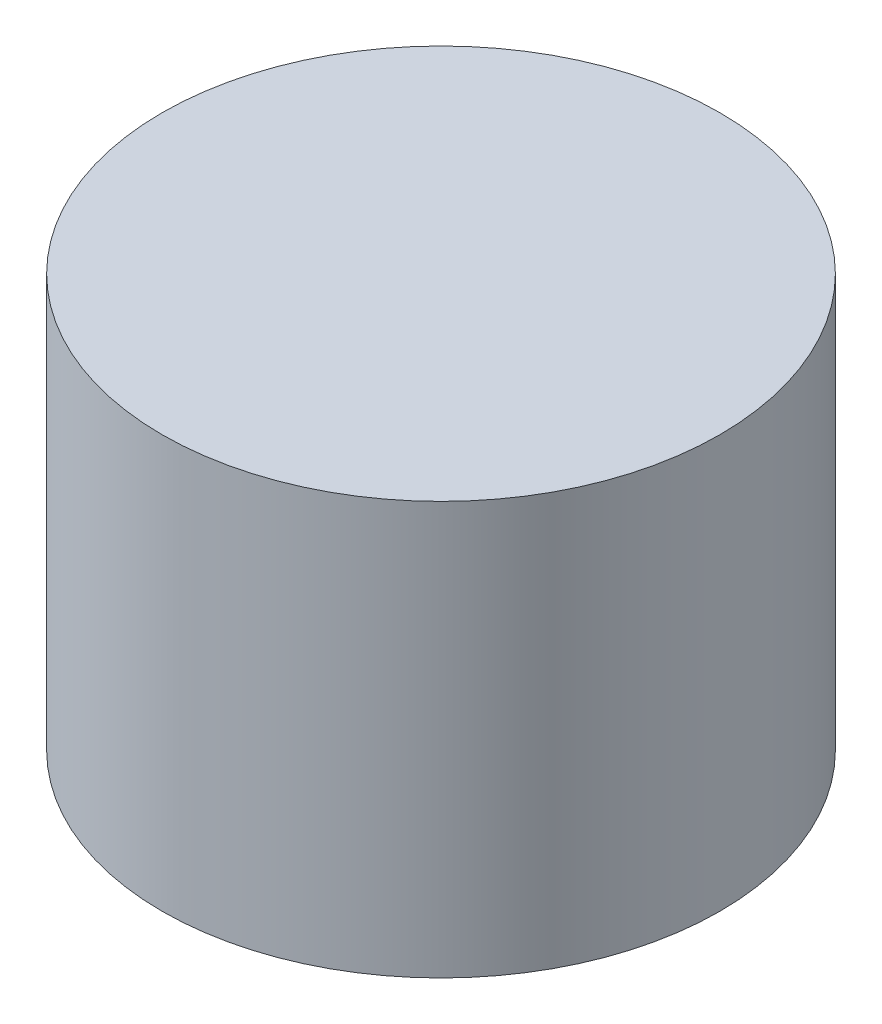
ISO-10303-21;
HEADER;
FILE_DESCRIPTION(('STEP AP214'),'2;1');
FILE_NAME('part.step','',(''),(''),'','','');
FILE_SCHEMA(('AUTOMOTIVE_DESIGN { 1 0 10303 214 1 1 1 1 }'));
ENDSEC;
DATA;
#1=APPLICATION_CONTEXT('core data for automotive mechanical design processes');
#2=APPLICATION_PROTOCOL_DEFINITION('international standard','automotive_design',2000,#1);
#3=PRODUCT_CONTEXT('',#1,'mechanical');
#4=PRODUCT('Part','Part','',(#3));
#5=PRODUCT_RELATED_PRODUCT_CATEGORY('part','',(#4));
#6=PRODUCT_DEFINITION_FORMATION('','',#4);
#7=PRODUCT_DEFINITION_CONTEXT('part definition',#1,'design');
#8=PRODUCT_DEFINITION('design','',#6,#7);
#9=PRODUCT_DEFINITION_SHAPE('','',#8);
#10=(LENGTH_UNIT() NAMED_UNIT(*) SI_UNIT(.MILLI.,.METRE.));
#11=(NAMED_UNIT(*) PLANE_ANGLE_UNIT() SI_UNIT($,.RADIAN.));
#12=(NAMED_UNIT(*) SI_UNIT($,.STERADIAN.) SOLID_ANGLE_UNIT());
#13=UNCERTAINTY_MEASURE_WITH_UNIT(LENGTH_MEASURE(1.E-05),#10,'distance_accuracy_value','');
#14=(GEOMETRIC_REPRESENTATION_CONTEXT(3) GLOBAL_UNCERTAINTY_ASSIGNED_CONTEXT((#13)) GLOBAL_UNIT_ASSIGNED_CONTEXT((#10,
#11,#12)) REPRESENTATION_CONTEXT('',''));
#15=CARTESIAN_POINT('',(0.,0.,0.));
#16=DIRECTION('',(0.,0.,1.));
#17=DIRECTION('',(1.,0.,0.));
#18=AXIS2_PLACEMENT_3D('',#15,#16,#17);
#19=CARTESIAN_POINT('',(-11.,-20.,0.));
#20=DIRECTION('',(0.,-1.,0.));
#21=DIRECTION('',(1.,0.,0.));
#22=AXIS2_PLACEMENT_3D('',#19,#20,#21);
#23=PLANE('',#22);
#24=DIRECTION('',(-0.5,0.,-0.866025403784439));
#25=VECTOR('',#24,1.);
#26=CARTESIAN_POINT('',(-10.1112159321677,-20.,-0.513139720814411));
#27=LINE('',#26,#25);
#28=CARTESIAN_POINT('',(-6.60890974693253,-20.,5.5530325356757));
#29=VERTEX_POINT('',#28);
#30=CARTESIAN_POINT('',(-8.11352211740294,-20.,2.9469674643243));
#31=VERTEX_POINT('',#30);
#32=EDGE_CURVE('E177',#29,#31,#27,.T.);
#33=ORIENTED_EDGE('',*,*,#32,.T.);
#34=CARTESIAN_POINT('',(0.,-20.,0.));
#35=DIRECTION('',(0.,-1.,0.));
#36=DIRECTION('',(1.,0.,0.));
#37=AXIS2_PLACEMENT_3D('',#34,#35,#36);
#38=CIRCLE('',#37,8.63214100819563);
#39=EDGE_CURVE('E211',#31,#29,#38,.F.);
#40=ORIENTED_EDGE('',*,*,#39,.T.);
#41=EDGE_LOOP('',(#33,#40));
#42=FACE_BOUND('',#41,.T.);
#43=ADVANCED_FACE('F35',(#42),#23,.F.);
#44=DIRECTION('',(-1.,0.,0.));
#45=VECTOR('',#44,1.);
#46=CARTESIAN_POINT('',(-11.,-20.,8.5));
#47=LINE('',#46,#45);
#48=CARTESIAN_POINT('',(1.5046123704704,-20.,8.5));
#49=VERTEX_POINT('',#48);
#50=CARTESIAN_POINT('',(-1.5046123704704,-20.,8.5));
#51=VERTEX_POINT('',#50);
#52=EDGE_CURVE('E174',#49,#51,#47,.T.);
#53=ORIENTED_EDGE('',*,*,#52,.T.);
#54=CARTESIAN_POINT('',(0.,-20.,0.));
#55=DIRECTION('',(0.,-1.,0.));
#56=DIRECTION('',(1.,0.,0.));
#57=AXIS2_PLACEMENT_3D('',#54,#55,#56);
#58=CIRCLE('',#57,8.63214100819563);
#59=EDGE_CURVE('E209',#51,#49,#58,.F.);
#60=ORIENTED_EDGE('',*,*,#59,.T.);
#61=EDGE_LOOP('',(#53,#60));
#62=FACE_BOUND('',#61,.T.);
#63=ADVANCED_FACE('F306',(#62),#23,.F.);
#64=DIRECTION('',(-0.5,0.,0.866025403784439));
#65=VECTOR('',#64,1.);
#66=CARTESIAN_POINT('',(4.61121593216773,-20.,9.01313972081442));
#67=LINE('',#66,#65);
#68=CARTESIAN_POINT('',(8.11352211740292,-20.,2.94696746432433));
#69=VERTEX_POINT('',#68);
#70=CARTESIAN_POINT('',(6.60890974693254,-20.,5.55303253567568));
#71=VERTEX_POINT('',#70);
#72=EDGE_CURVE('E167',#69,#71,#67,.T.);
#73=ORIENTED_EDGE('',*,*,#72,.T.);
#74=CARTESIAN_POINT('',(0.,-20.,0.));
#75=DIRECTION('',(0.,-1.,0.));
#76=DIRECTION('',(1.,0.,0.));
#77=AXIS2_PLACEMENT_3D('',#74,#75,#76);
#78=CIRCLE('',#77,8.63214100819563);
#79=EDGE_CURVE('E207',#71,#69,#78,.F.);
#80=ORIENTED_EDGE('',*,*,#79,.T.);
#81=EDGE_LOOP('',(#73,#80));
#82=FACE_BOUND('',#81,.T.);
#83=ADVANCED_FACE('F311',(#82),#23,.F.);
#84=DIRECTION('',(0.5,0.,0.866025403784439));
#85=VECTOR('',#84,1.);
#86=CARTESIAN_POINT('',(4.61121593216773,-20.,-9.0131397208144));
#87=LINE('',#86,#85);
#88=CARTESIAN_POINT('',(6.60890974693252,-20.,-5.55303253567571));
#89=VERTEX_POINT('',#88);
#90=CARTESIAN_POINT('',(8.11352211740294,-20.,-2.94696746432428));
#91=VERTEX_POINT('',#90);
#92=EDGE_CURVE('E186',#89,#91,#87,.T.);
#93=ORIENTED_EDGE('',*,*,#92,.T.);
#94=CARTESIAN_POINT('',(0.,-20.,0.));
#95=DIRECTION('',(0.,-1.,0.));
#96=DIRECTION('',(1.,0.,0.));
#97=AXIS2_PLACEMENT_3D('',#94,#95,#96);
#98=CIRCLE('',#97,8.63214100819563);
#99=EDGE_CURVE('E205',#91,#89,#98,.F.);
#100=ORIENTED_EDGE('',*,*,#99,.T.);
#101=EDGE_LOOP('',(#93,#100));
#102=FACE_BOUND('',#101,.T.);
#103=ADVANCED_FACE('F303',(#102),#23,.F.);
#104=DIRECTION('',(1.,0.,0.));
#105=VECTOR('',#104,1.);
#106=CARTESIAN_POINT('',(-11.,-20.,-8.5));
#107=LINE('',#106,#105);
#108=CARTESIAN_POINT('',(-1.50461237047042,-20.,-8.5));
#109=VERTEX_POINT('',#108);
#110=CARTESIAN_POINT('',(1.50461237047042,-20.,-8.5));
#111=VERTEX_POINT('',#110);
#112=EDGE_CURVE('E183',#109,#111,#107,.T.);
#113=ORIENTED_EDGE('',*,*,#112,.T.);
#114=CARTESIAN_POINT('',(0.,-20.,0.));
#115=DIRECTION('',(0.,-1.,0.));
#116=DIRECTION('',(1.,0.,0.));
#117=AXIS2_PLACEMENT_3D('',#114,#115,#116);
#118=CIRCLE('',#117,8.63214100819563);
#119=EDGE_CURVE('E203',#111,#109,#118,.F.);
#120=ORIENTED_EDGE('',*,*,#119,.T.);
#121=EDGE_LOOP('',(#113,#120));
#122=FACE_BOUND('',#121,.T.);
#123=ADVANCED_FACE('F294',(#122),#23,.F.);
#124=CARTESIAN_POINT('',(0.,0.,0.));
#125=DIRECTION('',(0.,-1.,0.));
#126=DIRECTION('',(-1.,0.,0.));
#127=AXIS2_PLACEMENT_3D('',#124,#125,#126);
#128=SPHERICAL_SURFACE('',#127,7.50000000000001);
#129=CARTESIAN_POINT('',(0.,1.25439547759709,0.));
#130=DIRECTION('',(0.,-1.,0.));
#131=DIRECTION('',(1.,0.,0.));
#132=AXIS2_PLACEMENT_3D('',#129,#130,#131);
#133=CIRCLE('',#132,7.39435541381289);
#134=CARTESIAN_POINT('',(7.39435541381289,1.25439547759709,0.));
#135=VERTEX_POINT('',#134);
#136=EDGE_CURVE('E195',#135,#135,#133,.T.);
#137=ORIENTED_EDGE('',*,*,#136,.T.);
#138=EDGE_LOOP('',(#137));
#139=FACE_BOUND('',#138,.T.);
#140=ADVANCED_FACE('F296',(#139),#128,.F.);
#141=CARTESIAN_POINT('',(0.,-20.,0.));
#142=DIRECTION('',(0.,-1.,0.));
#143=DIRECTION('',(1.,0.,0.));
#144=AXIS2_PLACEMENT_3D('',#141,#142,#143);
#145=CONICAL_SURFACE('',#144,11.,0.168042486170488);
#146=CARTESIAN_POINT('',(0.,-17.6654945393074,0.));
#147=DIRECTION('',(0.,-1.,0.));
#148=DIRECTION('',(1.,0.,0.));
#149=AXIS2_PLACEMENT_3D('',#146,#147,#148);
#150=CIRCLE('',#149,10.6039691185457);
#151=CARTESIAN_POINT('',(10.6039691185457,-17.6654945393074,0.));
#152=VERTEX_POINT('',#151);
#153=EDGE_CURVE('E198',#152,#152,#150,.T.);
#154=ORIENTED_EDGE('',*,*,#153,.T.);
#155=EDGE_LOOP('',(#154));
#156=FACE_BOUND('',#155,.T.);
#157=ORIENTED_EDGE('',*,*,#136,.F.);
#158=EDGE_LOOP('',(#157));
#159=FACE_BOUND('',#158,.T.);
#160=ADVANCED_FACE('F292',(#156,#159),#145,.F.);
#161=DIRECTION('',(0.5,0.,-0.866025403784439));
#162=VECTOR('',#161,1.);
#163=CARTESIAN_POINT('',(-10.1112159321677,-20.,0.513139720814411));
#164=LINE('',#163,#162);
#165=CARTESIAN_POINT('',(-8.11352211740294,-20.,-2.9469674643243));
#166=VERTEX_POINT('',#165);
#167=CARTESIAN_POINT('',(-6.60890974693253,-20.,-5.5530325356757));
#168=VERTEX_POINT('',#167);
#169=EDGE_CURVE('E180',#166,#168,#164,.T.);
#170=ORIENTED_EDGE('',*,*,#169,.T.);
#171=CARTESIAN_POINT('',(0.,-20.,0.));
#172=DIRECTION('',(0.,-1.,0.));
#173=DIRECTION('',(1.,0.,0.));
#174=AXIS2_PLACEMENT_3D('',#171,#172,#173);
#175=CIRCLE('',#174,8.63214100819563);
#176=EDGE_CURVE('E201',#168,#166,#175,.F.);
#177=ORIENTED_EDGE('',*,*,#176,.T.);
#178=EDGE_LOOP('',(#170,#177));
#179=FACE_BOUND('',#178,.T.);
#180=ADVANCED_FACE('F276',(#179),#23,.F.);
#181=CARTESIAN_POINT('',(4.90747728811182,-18.,-8.5));
#182=DIRECTION('',(0.866025403784439,0.,-0.5));
#183=DIRECTION('',(-0.5,0.,-0.866025403784439));
#184=AXIS2_PLACEMENT_3D('',#181,#182,#183);
#185=PLANE('',#184);
#186=DIRECTION('',(0.,-1.,0.));
#187=VECTOR('',#186,1.);
#188=CARTESIAN_POINT('',(4.90747728811182,-18.,-8.5));
#189=LINE('',#188,#187);
#190=CARTESIAN_POINT('',(4.90747728811182,-19.6127467449322,-8.5));
#191=VERTEX_POINT('',#190);
#192=CARTESIAN_POINT('',(4.90747728811182,-22.,-8.5));
#193=VERTEX_POINT('',#192);
#194=EDGE_CURVE('E165',#191,#193,#189,.T.);
#195=ORIENTED_EDGE('',*,*,#194,.T.);
#196=DIRECTION('',(0.5,0.,0.866025403784439));
#197=VECTOR('',#196,1.);
#198=CARTESIAN_POINT('',(4.90747728811182,-22.,-8.5));
#199=LINE('',#198,#197);
#200=CARTESIAN_POINT('',(9.81495457622364,-22.,0.));
#201=VERTEX_POINT('',#200);
#202=EDGE_CURVE('E150',#193,#201,#199,.T.);
#203=ORIENTED_EDGE('',*,*,#202,.T.);
#204=DIRECTION('',(0.,-1.,0.));
#205=VECTOR('',#204,1.);
#206=CARTESIAN_POINT('',(9.81495457622363,-18.,0.));
#207=LINE('',#206,#205);
#208=CARTESIAN_POINT('',(9.81495457622363,-19.6127467449322,0.));
#209=VERTEX_POINT('',#208);
#210=EDGE_CURVE('E141',#209,#201,#207,.T.);
#211=ORIENTED_EDGE('',*,*,#210,.F.);
#212=CARTESIAN_POINT('',(9.81495457622363,-19.6127467449322,0.));
#213=CARTESIAN_POINT('',(9.77143177180953,-19.6446416450822,-0.0753837085331061));
#214=CARTESIAN_POINT('',(9.72740201547438,-19.6736151409644,-0.151645483550461));
#215=CARTESIAN_POINT('',(9.63861698781365,-19.726385279256,-0.305425662410259));
#216=CARTESIAN_POINT('',(9.59386247618449,-19.7501870075362,-0.3829427504199));
#217=CARTESIAN_POINT('',(9.50400881521421,-19.7932538368433,-0.538573856466488));
#218=CARTESIAN_POINT('',(9.45891175082192,-19.8125366436572,-0.616684263266136));
#219=CARTESIAN_POINT('',(9.36834246528132,-19.8472799111159,-0.773554867427667));
#220=CARTESIAN_POINT('',(9.32287014496797,-19.862739325639,-0.852315236548439));
#221=CARTESIAN_POINT('',(9.18676291002431,-19.9039883883797,-1.08805988274857));
#222=CARTESIAN_POINT('',(9.09576295407781,-19.9249534215553,-1.24567642993445));
#223=CARTESIAN_POINT('',(8.9132907888821,-19.9575739447718,-1.56172749102052));
#224=CARTESIAN_POINT('',(8.82181818454491,-19.9692196516593,-1.72016268923318));
#225=CARTESIAN_POINT('',(8.67901550176883,-19.9824102913571,-1.96750419125849));
#226=CARTESIAN_POINT('',(8.62773070411942,-19.9861449599334,-2.05633206644315));
#227=CARTESIAN_POINT('',(8.52516074376336,-19.9920571588999,-2.23398844911018));
#228=CARTESIAN_POINT('',(8.47387559055704,-19.9942353532877,-2.32281694013747));
#229=CARTESIAN_POINT('',(8.37107893416187,-19.9974538334883,-2.5008659718621));
#230=CARTESIAN_POINT('',(8.31956739741149,-19.9984892323533,-2.59008657068972));
#231=CARTESIAN_POINT('',(8.21654419075095,-19.9997579764712,-2.76852799898444));
#232=CARTESIAN_POINT('',(8.16503252097513,-19.999991361655,-2.85774882821887));
#233=CARTESIAN_POINT('',(8.11352211740294,-20.,-2.94696746432428));
#234=B_SPLINE_CURVE_WITH_KNOTS('',3,(#212,#213,#214,#215,#216,#217,#218,#219,#220,#221,#222,
#223,#224,#225,#226,#227,#228,#229,#230,#231,#232,#233),.UNSPECIFIED.,.F.,.F.,(4,2,2,2,2,2,2,2,
2,2,4),(0.,0.277986713104551,0.555698806734272,0.83230387880707,1.1089845495155,
1.65820646982105,2.20800419349869,2.51590596143274,2.82367629881368,3.13275771876241,
3.4418237498686),.UNSPECIFIED.);
#235=EDGE_CURVE('E259',#209,#91,#234,.T.);
#236=ORIENTED_EDGE('',*,*,#235,.T.);
#237=ORIENTED_EDGE('',*,*,#92,.F.);
#238=CARTESIAN_POINT('',(6.60890974693252,-20.,-5.55303253567571));
#239=CARTESIAN_POINT('',(6.53720820085862,-19.9999675270954,-5.67722325645693));
#240=CARTESIAN_POINT('',(6.46550034313456,-19.9995305190983,-5.80142490933693));
#241=CARTESIAN_POINT('',(6.32208304385279,-19.9968304625014,-6.04983095837727));
#242=CARTESIAN_POINT('',(6.25037360381365,-19.9945671272494,-6.17403535190737));
#243=CARTESIAN_POINT('',(6.10749064395142,-19.9872227205461,-6.42151589792457));
#244=CARTESIAN_POINT('',(6.03631690011527,-19.9821615669874,-6.54479243841367));
#245=CARTESIAN_POINT('',(5.89405046679016,-19.9680160820096,-6.79120512914438));
#246=CARTESIAN_POINT('',(5.82295779485901,-19.9589310017301,-6.91434124897496));
#247=CARTESIAN_POINT('',(5.68052770484419,-19.93526709798,-7.16103740140725));
#248=CARTESIAN_POINT('',(5.60919167701496,-19.9206531281522,-7.28459502601762));
#249=CARTESIAN_POINT('',(5.46701474857931,-19.884302076187,-7.53085268973224));
#250=CARTESIAN_POINT('',(5.39617352888379,-19.8625701225869,-7.65355328151504));
#251=CARTESIAN_POINT('',(5.25481770503352,-19.8098736573513,-7.89838875036946));
#252=CARTESIAN_POINT('',(5.1843086346605,-19.7788471126284,-8.02051404264998));
#253=CARTESIAN_POINT('',(5.07959044370922,-19.7236467808191,-8.20189126985429));
#254=CARTESIAN_POINT('',(5.04481345111204,-19.7037713026189,-8.26212678796706));
#255=CARTESIAN_POINT('',(4.97574513988698,-19.6607774192049,-8.38175661220184));
#256=CARTESIAN_POINT('',(4.94145409629528,-19.6376572524118,-8.44115044194722));
#257=CARTESIAN_POINT('',(4.90747728811182,-19.612746744932,-8.5));
#258=B_SPLINE_CURVE_WITH_KNOTS('',3,(#238,#239,#240,#241,#242,#243,#244,#245,#246,#247,#248,
#249,#250,#251,#252,#253,#254,#255,#256,#257),.UNSPECIFIED.,.F.,.F.,(4,2,2,2,2,2,2,2,2,4),(0.,
0.430228697579471,0.860524935049129,1.28779658997689,1.71514779441003,2.14526254212575,
2.57506806956906,3.00780861502878,3.22475177823917,3.44181318136555),.UNSPECIFIED.);
#259=EDGE_CURVE('E265',#89,#191,#258,.T.);
#260=ORIENTED_EDGE('',*,*,#259,.T.);
#261=EDGE_LOOP('',(#195,#203,#211,#236,#237,#260));
#262=FACE_BOUND('',#261,.T.);
#263=ADVANCED_FACE('F271',(#262),#185,.F.);
#264=CARTESIAN_POINT('',(-4.90747728811182,-18.,-8.5));
#265=DIRECTION('',(0.,0.,-1.));
#266=DIRECTION('',(-1.,0.,0.));
#267=AXIS2_PLACEMENT_3D('',#264,#265,#266);
#268=PLANE('',#267);
#269=DIRECTION('',(0.,-1.,0.));
#270=VECTOR('',#269,1.);
#271=CARTESIAN_POINT('',(-4.90747728811182,-18.,-8.5));
#272=LINE('',#271,#270);
#273=CARTESIAN_POINT('',(-4.90747728811182,-19.6127467449322,-8.5));
#274=VERTEX_POINT('',#273);
#275=CARTESIAN_POINT('',(-4.90747728811182,-22.,-8.5));
#276=VERTEX_POINT('',#275);
#277=EDGE_CURVE('E63',#274,#276,#272,.T.);
#278=ORIENTED_EDGE('',*,*,#277,.T.);
#279=DIRECTION('',(1.,0.,0.));
#280=VECTOR('',#279,1.);
#281=CARTESIAN_POINT('',(-4.90747728811182,-22.,-8.5));
#282=LINE('',#281,#280);
#283=EDGE_CURVE('E162',#276,#193,#282,.T.);
#284=ORIENTED_EDGE('',*,*,#283,.T.);
#285=ORIENTED_EDGE('',*,*,#194,.F.);
#286=CARTESIAN_POINT('',(4.90747728811182,-19.6127467449322,-8.5));
#287=CARTESIAN_POINT('',(4.82043167928361,-19.6446416450822,-8.5));
#288=CARTESIAN_POINT('',(4.73237216661332,-19.6736151409644,-8.5));
#289=CARTESIAN_POINT('',(4.55480211129185,-19.726385279256,-8.5));
#290=CARTESIAN_POINT('',(4.46529308803353,-19.7501870075362,-8.5));
#291=CARTESIAN_POINT('',(4.28558576609298,-19.7932538368433,-8.5));
#292=CARTESIAN_POINT('',(4.1953916373084,-19.8125366436572,-8.5));
#293=CARTESIAN_POINT('',(4.0142530662272,-19.8472799111159,-8.5));
#294=CARTESIAN_POINT('',(3.9233084256005,-19.862739325639,-8.5));
#295=CARTESIAN_POINT('',(3.65109395571318,-19.9039883883797,-8.5));
#296=CARTESIAN_POINT('',(3.46909404382018,-19.9249534215553,-8.5));
#297=CARTESIAN_POINT('',(3.10414971342875,-19.9575739447718,-8.5));
#298=CARTESIAN_POINT('',(2.92120450475438,-19.9692196516593,-8.5));
#299=CARTESIAN_POINT('',(2.63559913920222,-19.982410291357,-8.5));
#300=CARTESIAN_POINT('',(2.5330295439034,-19.9861449599334,-8.5));
#301=CARTESIAN_POINT('',(2.32788962319127,-19.9920571588999,-8.5));
#302=CARTESIAN_POINT('',(2.22531931677864,-19.9942353532877,-8.5));
#303=CARTESIAN_POINT('',(2.01972600398829,-19.9974538334883,-8.5));
#304=CARTESIAN_POINT('',(1.91670293048752,-19.9984892323533,-8.5));
#305=CARTESIAN_POINT('',(1.71065651716645,-19.9997579764712,-8.5));
#306=CARTESIAN_POINT('',(1.60763317761479,-19.999991361655,-8.5));
#307=CARTESIAN_POINT('',(1.50461237047042,-20.,-8.5));
#308=B_SPLINE_CURVE_WITH_KNOTS('',3,(#286,#287,#288,#289,#290,#291,#292,#293,#294,#295,#296,
#297,#298,#299,#300,#301,#302,#303,#304,#305,#306,#307),.UNSPECIFIED.,.F.,.F.,(4,2,2,2,2,2,2,2,
2,2,4),(0.,0.277986713104548,0.555698806734269,0.832303878807064,1.10898454951549,
1.65820646982104,2.20800419349867,2.51590596143273,2.82367629881368,3.13275771876242,
3.44182374986861),.UNSPECIFIED.);
#309=EDGE_CURVE('E339',#191,#111,#308,.T.);
#310=ORIENTED_EDGE('',*,*,#309,.T.);
#311=ORIENTED_EDGE('',*,*,#112,.F.);
#312=CARTESIAN_POINT('',(-1.50461237047042,-20.,-8.5));
#313=CARTESIAN_POINT('',(-1.64801546261821,-19.9999675270954,-8.5));
#314=CARTESIAN_POINT('',(-1.79143117806633,-19.9995305190983,-8.5));
#315=CARTESIAN_POINT('',(-2.07826577662988,-19.9968304625014,-8.5));
#316=CARTESIAN_POINT('',(-2.22168465670815,-19.9945671272494,-8.5));
#317=CARTESIAN_POINT('',(-2.5074505764326,-19.9872227205461,-8.5));
#318=CARTESIAN_POINT('',(-2.6497980641049,-19.9821615669874,-8.5));
#319=CARTESIAN_POINT('',(-2.93433093075512,-19.9680160820096,-8.5));
#320=CARTESIAN_POINT('',(-3.07651627461743,-19.9589310017301,-8.5));
#321=CARTESIAN_POINT('',(-3.36137645464708,-19.93526709798,-8.5));
#322=CARTESIAN_POINT('',(-3.50404851030554,-19.9206531281522,-8.5));
#323=CARTESIAN_POINT('',(-3.78840236717683,-19.884302076187,-8.5));
#324=CARTESIAN_POINT('',(-3.93008480656788,-19.8625701225869,-8.5));
#325=CARTESIAN_POINT('',(-4.21279645426841,-19.8098736573513,-8.5));
#326=CARTESIAN_POINT('',(-4.35381459501445,-19.7788471126284,-8.5));
#327=CARTESIAN_POINT('',(-4.56325097691701,-19.7236467808191,-8.5));
#328=CARTESIAN_POINT('',(-4.63280496211138,-19.7037713026189,-8.5));
#329=CARTESIAN_POINT('',(-4.77094158456149,-19.6607774192049,-8.5));
#330=CARTESIAN_POINT('',(-4.8395236717449,-19.6376572524119,-8.5));
#331=CARTESIAN_POINT('',(-4.90747728811182,-19.612746744932,-8.5));
#332=B_SPLINE_CURVE_WITH_KNOTS('',3,(#312,#313,#314,#315,#316,#317,#318,#319,#320,#321,#322,
#323,#324,#325,#326,#327,#328,#329,#330,#331),.UNSPECIFIED.,.F.,.F.,(4,2,2,2,2,2,2,2,2,4),(0.,
0.43022869757947,0.860524935049128,1.28779658997689,1.71514779441003,2.14526254212575,
2.57506806956906,3.00780861502878,3.22475177823917,3.44181318136555),.UNSPECIFIED.);
#333=EDGE_CURVE('E340',#109,#274,#332,.T.);
#334=ORIENTED_EDGE('',*,*,#333,.T.);
#335=EDGE_LOOP('',(#278,#284,#285,#310,#311,#334));
#336=FACE_BOUND('',#335,.T.);
#337=ADVANCED_FACE('F275',(#336),#268,.F.);
#338=CARTESIAN_POINT('',(-9.81495457622364,-18.,0.));
#339=DIRECTION('',(-0.866025403784439,0.,-0.5));
#340=DIRECTION('',(-0.5,0.,0.866025403784439));
#341=AXIS2_PLACEMENT_3D('',#338,#339,#340);
#342=PLANE('',#341);
#343=DIRECTION('',(0.,-1.,0.));
#344=VECTOR('',#343,1.);
#345=CARTESIAN_POINT('',(-9.81495457622364,-18.,0.));
#346=LINE('',#345,#344);
#347=CARTESIAN_POINT('',(-9.81495457622364,-19.6127467449322,0.));
#348=VERTEX_POINT('',#347);
#349=CARTESIAN_POINT('',(-9.81495457622364,-22.,0.));
#350=VERTEX_POINT('',#349);
#351=EDGE_CURVE('E55',#348,#350,#346,.T.);
#352=ORIENTED_EDGE('',*,*,#351,.T.);
#353=DIRECTION('',(0.5,0.,-0.866025403784439));
#354=VECTOR('',#353,1.);
#355=CARTESIAN_POINT('',(-9.81495457622364,-22.,0.));
#356=LINE('',#355,#354);
#357=EDGE_CURVE('E157',#350,#276,#356,.T.);
#358=ORIENTED_EDGE('',*,*,#357,.T.);
#359=ORIENTED_EDGE('',*,*,#277,.F.);
#360=CARTESIAN_POINT('',(-4.90747728811182,-19.6127467449322,-8.5));
#361=CARTESIAN_POINT('',(-4.95100009252592,-19.6446416450822,-8.42461629146689));
#362=CARTESIAN_POINT('',(-4.99502984886107,-19.6736151409644,-8.34835451644954));
#363=CARTESIAN_POINT('',(-5.0838148765218,-19.726385279256,-8.19457433758974));
#364=CARTESIAN_POINT('',(-5.12856938815097,-19.7501870075362,-8.1170572495801));
#365=CARTESIAN_POINT('',(-5.21842304912124,-19.7932538368433,-7.96142614353351));
#366=CARTESIAN_POINT('',(-5.26352011351353,-19.8125366436572,-7.88331573673386));
#367=CARTESIAN_POINT('',(-5.35408939905413,-19.8472799111159,-7.72644513257233));
#368=CARTESIAN_POINT('',(-5.39956171936748,-19.862739325639,-7.64768476345156));
#369=CARTESIAN_POINT('',(-5.53566895431114,-19.9039883883797,-7.41194011725143));
#370=CARTESIAN_POINT('',(-5.62666891025764,-19.9249534215553,-7.25432357006556));
#371=CARTESIAN_POINT('',(-5.80914107545336,-19.9575739447718,-6.93827250897948));
#372=CARTESIAN_POINT('',(-5.90061367979054,-19.9692196516593,-6.77983731076683));
#373=CARTESIAN_POINT('',(-6.04341636256662,-19.982410291357,-6.53249580874152));
#374=CARTESIAN_POINT('',(-6.09470116021603,-19.9861449599334,-6.44366793355686));
#375=CARTESIAN_POINT('',(-6.1972711205721,-19.9920571588999,-6.26601155088982));
#376=CARTESIAN_POINT('',(-6.24855627377841,-19.9942353532877,-6.17718305986253));
#377=CARTESIAN_POINT('',(-6.35135293017358,-19.9974538334883,-5.99913402813789));
#378=CARTESIAN_POINT('',(-6.40286446692397,-19.9984892323533,-5.90991342931027));
#379=CARTESIAN_POINT('',(-6.50588767358451,-19.9997579764712,-5.73147200101555));
#380=CARTESIAN_POINT('',(-6.55739934336034,-19.999991361655,-5.64225117178111));
#381=CARTESIAN_POINT('',(-6.60890974693253,-20.,-5.5530325356757));
#382=B_SPLINE_CURVE_WITH_KNOTS('',3,(#360,#361,#362,#363,#364,#365,#366,#367,#368,#369,#370,
#371,#372,#373,#374,#375,#376,#377,#378,#379,#380,#381),.UNSPECIFIED.,.F.,.F.,(4,2,2,2,2,2,2,2,
2,2,4),(0.,0.277986713104549,0.55569880673427,0.832303878807066,1.10898454951549,
1.65820646982104,2.20800419349867,2.51590596143273,2.82367629881368,3.13275771876242,
3.44182374986862),.UNSPECIFIED.);
#383=EDGE_CURVE('E343',#274,#168,#382,.T.);
#384=ORIENTED_EDGE('',*,*,#383,.T.);
#385=ORIENTED_EDGE('',*,*,#169,.F.);
#386=CARTESIAN_POINT('',(-8.11352211740294,-20.,-2.9469674643243));
#387=CARTESIAN_POINT('',(-8.18522366347683,-19.9999675270954,-2.82277674354308));
#388=CARTESIAN_POINT('',(-8.25693152120089,-19.9995305190983,-2.69857509066308));
#389=CARTESIAN_POINT('',(-8.40034882048266,-19.9968304625014,-2.45016904162274));
#390=CARTESIAN_POINT('',(-8.4720582605218,-19.9945671272494,-2.32596464809264));
#391=CARTESIAN_POINT('',(-8.61494122038403,-19.9872227205461,-2.07848410207544));
#392=CARTESIAN_POINT('',(-8.68611496422018,-19.9821615669874,-1.95520756158634));
#393=CARTESIAN_POINT('',(-8.82838139754529,-19.9680160820096,-1.70879487085563));
#394=CARTESIAN_POINT('',(-8.89947406947644,-19.9589310017301,-1.58565875102505));
#395=CARTESIAN_POINT('',(-9.04190415949127,-19.93526709798,-1.33896259859276));
#396=CARTESIAN_POINT('',(-9.1132401873205,-19.9206531281522,-1.21540497398239));
#397=CARTESIAN_POINT('',(-9.25541711575614,-19.884302076187,-0.969147310267768));
#398=CARTESIAN_POINT('',(-9.32625833545167,-19.8625701225869,-0.846446718484971));
#399=CARTESIAN_POINT('',(-9.46761415930194,-19.8098736573513,-0.601611249630547));
#400=CARTESIAN_POINT('',(-9.53812322967496,-19.7788471126284,-0.479485957350027));
#401=CARTESIAN_POINT('',(-9.64284142062624,-19.7236467808191,-0.298108730145713));
#402=CARTESIAN_POINT('',(-9.67761841322342,-19.7037713026189,-0.237873212032946));
#403=CARTESIAN_POINT('',(-9.74668672444847,-19.6607774192049,-0.11824338779817));
#404=CARTESIAN_POINT('',(-9.78097776804018,-19.6376572524118,-0.0588495580527807));
#405=CARTESIAN_POINT('',(-9.81495457622364,-19.612746744932,0.));
#406=B_SPLINE_CURVE_WITH_KNOTS('',3,(#386,#387,#388,#389,#390,#391,#392,#393,#394,#395,#396,
#397,#398,#399,#400,#401,#402,#403,#404,#405),.UNSPECIFIED.,.F.,.F.,(4,2,2,2,2,2,2,2,2,4),(0.,
0.430228697579472,0.860524935049131,1.2877965899769,1.71514779441004,2.14526254212576,
2.57506806956907,3.0078086150288,3.22475177823918,3.44181318136556),.UNSPECIFIED.);
#407=EDGE_CURVE('E49',#166,#348,#406,.T.);
#408=ORIENTED_EDGE('',*,*,#407,.T.);
#409=EDGE_LOOP('',(#352,#358,#359,#384,#385,#408));
#410=FACE_BOUND('',#409,.T.);
#411=ADVANCED_FACE('F232',(#410),#342,.F.);
#412=CARTESIAN_POINT('',(-4.90747728811182,-18.,8.5));
#413=DIRECTION('',(-0.866025403784439,0.,0.5));
#414=DIRECTION('',(0.5,0.,0.866025403784439));
#415=AXIS2_PLACEMENT_3D('',#412,#413,#414);
#416=PLANE('',#415);
#417=DIRECTION('',(0.,-1.,0.));
#418=VECTOR('',#417,1.);
#419=CARTESIAN_POINT('',(-4.90747728811182,-18.,8.5));
#420=LINE('',#419,#418);
#421=CARTESIAN_POINT('',(-4.90747728811182,-19.6127467449322,8.5));
#422=VERTEX_POINT('',#421);
#423=CARTESIAN_POINT('',(-4.90747728811182,-22.,8.5));
#424=VERTEX_POINT('',#423);
#425=EDGE_CURVE('E140',#422,#424,#420,.T.);
#426=ORIENTED_EDGE('',*,*,#425,.T.);
#427=DIRECTION('',(-0.5,0.,-0.866025403784439));
#428=VECTOR('',#427,1.);
#429=CARTESIAN_POINT('',(-4.90747728811182,-22.,8.5));
#430=LINE('',#429,#428);
#431=EDGE_CURVE('E155',#424,#350,#430,.T.);
#432=ORIENTED_EDGE('',*,*,#431,.T.);
#433=ORIENTED_EDGE('',*,*,#351,.F.);
#434=CARTESIAN_POINT('',(-9.81495457622364,-19.6127467449322,0.));
#435=CARTESIAN_POINT('',(-9.77143177180954,-19.6446416450822,0.0753837085331089));
#436=CARTESIAN_POINT('',(-9.72740201547439,-19.6736151409644,0.151645483550463));
#437=CARTESIAN_POINT('',(-9.63861698781366,-19.726385279256,0.30542566241026));
#438=CARTESIAN_POINT('',(-9.5938624761845,-19.7501870075362,0.382942750419901));
#439=CARTESIAN_POINT('',(-9.50400881521422,-19.7932538368433,0.538573856466489));
#440=CARTESIAN_POINT('',(-9.45891175082193,-19.8125366436572,0.616684263266138));
#441=CARTESIAN_POINT('',(-9.36834246528133,-19.8472799111159,0.773554867427668));
#442=CARTESIAN_POINT('',(-9.32287014496798,-19.862739325639,0.852315236548439));
#443=CARTESIAN_POINT('',(-9.18676291002432,-19.9039883883797,1.08805988274857));
#444=CARTESIAN_POINT('',(-9.09576295407782,-19.9249534215553,1.24567642993444));
#445=CARTESIAN_POINT('',(-8.91329078888211,-19.9575739447718,1.56172749102052));
#446=CARTESIAN_POINT('',(-8.82181818454492,-19.9692196516593,1.72016268923318));
#447=CARTESIAN_POINT('',(-8.67901550176884,-19.982410291357,1.96750419125848));
#448=CARTESIAN_POINT('',(-8.62773070411943,-19.9861449599334,2.05633206644315));
#449=CARTESIAN_POINT('',(-8.52516074376336,-19.9920571588999,2.23398844911018));
#450=CARTESIAN_POINT('',(-8.47387559055705,-19.9942353532877,2.32281694013747));
#451=CARTESIAN_POINT('',(-8.37107893416188,-19.9974538334883,2.50086597186211));
#452=CARTESIAN_POINT('',(-8.31956739741149,-19.9984892323533,2.59008657068973));
#453=CARTESIAN_POINT('',(-8.21654419075095,-19.9997579764712,2.76852799898445));
#454=CARTESIAN_POINT('',(-8.16503252097513,-19.999991361655,2.85774882821889));
#455=CARTESIAN_POINT('',(-8.11352211740294,-20.,2.9469674643243));
#456=B_SPLINE_CURVE_WITH_KNOTS('',3,(#434,#435,#436,#437,#438,#439,#440,#441,#442,#443,#444,
#445,#446,#447,#448,#449,#450,#451,#452,#453,#454,#455),.UNSPECIFIED.,.F.,.F.,(4,2,2,2,2,2,2,2,
2,2,4),(0.,0.277986713104549,0.555698806734271,0.832303878807067,1.10898454951549,
1.65820646982104,2.20800419349868,2.51590596143274,2.82367629881368,3.13275771876242,
3.44182374986862),.UNSPECIFIED.);
#457=EDGE_CURVE('E11',#348,#31,#456,.T.);
#458=ORIENTED_EDGE('',*,*,#457,.T.);
#459=ORIENTED_EDGE('',*,*,#32,.F.);
#460=CARTESIAN_POINT('',(-6.60890974693253,-20.,5.5530325356757));
#461=CARTESIAN_POINT('',(-6.53720820085864,-19.9999675270954,5.67722325645692));
#462=CARTESIAN_POINT('',(-6.46550034313457,-19.9995305190983,5.80142490933692));
#463=CARTESIAN_POINT('',(-6.3220830438528,-19.9968304625014,6.04983095837726));
#464=CARTESIAN_POINT('',(-6.25037360381366,-19.9945671272494,6.17403535190736));
#465=CARTESIAN_POINT('',(-6.10749064395144,-19.9872227205461,6.42151589792456));
#466=CARTESIAN_POINT('',(-6.03631690011529,-19.9821615669874,6.54479243841366));
#467=CARTESIAN_POINT('',(-5.89405046679017,-19.9680160820096,6.79120512914437));
#468=CARTESIAN_POINT('',(-5.82295779485902,-19.9589310017301,6.91434124897495));
#469=CARTESIAN_POINT('',(-5.68052770484419,-19.93526709798,7.16103740140724));
#470=CARTESIAN_POINT('',(-5.60919167701496,-19.9206531281522,7.28459502601762));
#471=CARTESIAN_POINT('',(-5.46701474857932,-19.884302076187,7.53085268973224));
#472=CARTESIAN_POINT('',(-5.3961735288838,-19.8625701225869,7.65355328151503));
#473=CARTESIAN_POINT('',(-5.25481770503353,-19.8098736573513,7.89838875036946));
#474=CARTESIAN_POINT('',(-5.18430863466051,-19.7788471126284,8.02051404264997));
#475=CARTESIAN_POINT('',(-5.07959044370923,-19.7236467808191,8.20189126985429));
#476=CARTESIAN_POINT('',(-5.04481345111204,-19.7037713026189,8.26212678796706));
#477=CARTESIAN_POINT('',(-4.97574513988699,-19.6607774192049,8.38175661220184));
#478=CARTESIAN_POINT('',(-4.94145409629528,-19.6376572524118,8.44115044194722));
#479=CARTESIAN_POINT('',(-4.90747728811182,-19.612746744932,8.5));
#480=B_SPLINE_CURVE_WITH_KNOTS('',3,(#460,#461,#462,#463,#464,#465,#466,#467,#468,#469,#470,
#471,#472,#473,#474,#475,#476,#477,#478,#479),.UNSPECIFIED.,.F.,.F.,(4,2,2,2,2,2,2,2,2,4),(0.,
0.430228697579472,0.860524935049132,1.2877965899769,1.71514779441004,2.14526254212576,
2.57506806956907,3.0078086150288,3.22475177823918,3.44181318136557),.UNSPECIFIED.);
#481=EDGE_CURVE('E214',#29,#422,#480,.T.);
#482=ORIENTED_EDGE('',*,*,#481,.T.);
#483=EDGE_LOOP('',(#426,#432,#433,#458,#459,#482));
#484=FACE_BOUND('',#483,.T.);
#485=ADVANCED_FACE('F228',(#484),#416,.F.);
#486=CARTESIAN_POINT('',(4.90747728811181,-18.,8.5));
#487=DIRECTION('',(0.,0.,1.));
#488=DIRECTION('',(1.,0.,0.));
#489=AXIS2_PLACEMENT_3D('',#486,#487,#488);
#490=PLANE('',#489);
#491=DIRECTION('',(0.,-1.,0.));
#492=VECTOR('',#491,1.);
#493=CARTESIAN_POINT('',(4.90747728811181,-18.,8.5));
#494=LINE('',#493,#492);
#495=CARTESIAN_POINT('',(4.90747728811181,-19.6127467449322,8.5));
#496=VERTEX_POINT('',#495);
#497=CARTESIAN_POINT('',(4.90747728811181,-22.,8.5));
#498=VERTEX_POINT('',#497);
#499=EDGE_CURVE('E129',#496,#498,#494,.T.);
#500=ORIENTED_EDGE('',*,*,#499,.T.);
#501=DIRECTION('',(-1.,0.,0.));
#502=VECTOR('',#501,1.);
#503=CARTESIAN_POINT('',(4.90747728811181,-22.,8.5));
#504=LINE('',#503,#502);
#505=EDGE_CURVE('E133',#498,#424,#504,.T.);
#506=ORIENTED_EDGE('',*,*,#505,.T.);
#507=ORIENTED_EDGE('',*,*,#425,.F.);
#508=CARTESIAN_POINT('',(-4.90747728811182,-19.6127467449322,8.5));
#509=CARTESIAN_POINT('',(-4.82043167928362,-19.6446416450822,8.5));
#510=CARTESIAN_POINT('',(-4.73237216661332,-19.6736151409644,8.5));
#511=CARTESIAN_POINT('',(-4.55480211129185,-19.726385279256,8.5));
#512=CARTESIAN_POINT('',(-4.46529308803353,-19.7501870075362,8.5));
#513=CARTESIAN_POINT('',(-4.28558576609298,-19.7932538368433,8.5));
#514=CARTESIAN_POINT('',(-4.1953916373084,-19.8125366436571,8.5));
#515=CARTESIAN_POINT('',(-4.01425306622721,-19.8472799111159,8.5));
#516=CARTESIAN_POINT('',(-3.9233084256005,-19.862739325639,8.5));
#517=CARTESIAN_POINT('',(-3.65109395571319,-19.9039883883797,8.5));
#518=CARTESIAN_POINT('',(-3.46909404382018,-19.9249534215553,8.5));
#519=CARTESIAN_POINT('',(-3.10414971342876,-19.9575739447718,8.5));
#520=CARTESIAN_POINT('',(-2.92120450475438,-19.9692196516593,8.5));
#521=CARTESIAN_POINT('',(-2.63559913920222,-19.982410291357,8.5));
#522=CARTESIAN_POINT('',(-2.5330295439034,-19.9861449599334,8.5));
#523=CARTESIAN_POINT('',(-2.32788962319126,-19.9920571588999,8.5));
#524=CARTESIAN_POINT('',(-2.22531931677864,-19.9942353532877,8.5));
#525=CARTESIAN_POINT('',(-2.01972600398829,-19.9974538334883,8.5));
#526=CARTESIAN_POINT('',(-1.91670293048751,-19.9984892323533,8.5));
#527=CARTESIAN_POINT('',(-1.71065651716643,-19.9997579764712,8.5));
#528=CARTESIAN_POINT('',(-1.60763317761478,-19.999991361655,8.5));
#529=CARTESIAN_POINT('',(-1.5046123704704,-20.,8.5));
#530=B_SPLINE_CURVE_WITH_KNOTS('',3,(#508,#509,#510,#511,#512,#513,#514,#515,#516,#517,#518,
#519,#520,#521,#522,#523,#524,#525,#526,#527,#528,#529),.UNSPECIFIED.,.F.,.F.,(4,2,2,2,2,2,2,2,
2,2,4),(0.,0.277986713104549,0.555698806734268,0.832303878807062,1.10898454951549,
1.65820646982104,2.20800419349867,2.51590596143273,2.82367629881369,3.13275771876243,
3.44182374986863),.UNSPECIFIED.);
#531=EDGE_CURVE('E221',#422,#51,#530,.T.);
#532=ORIENTED_EDGE('',*,*,#531,.T.);
#533=ORIENTED_EDGE('',*,*,#52,.F.);
#534=CARTESIAN_POINT('',(1.5046123704704,-20.,8.5));
#535=CARTESIAN_POINT('',(1.64801546261818,-19.9999675270954,8.5));
#536=CARTESIAN_POINT('',(1.79143117806631,-19.9995305190983,8.5));
#537=CARTESIAN_POINT('',(2.07826577662985,-19.9968304625014,8.5));
#538=CARTESIAN_POINT('',(2.22168465670813,-19.9945671272494,8.5));
#539=CARTESIAN_POINT('',(2.50745057643258,-19.9872227205461,8.5));
#540=CARTESIAN_POINT('',(2.64979806410488,-19.9821615669874,8.5));
#541=CARTESIAN_POINT('',(2.9343309307551,-19.9680160820096,8.5));
#542=CARTESIAN_POINT('',(3.07651627461741,-19.9589310017301,8.5));
#543=CARTESIAN_POINT('',(3.36137645464706,-19.93526709798,8.5));
#544=CARTESIAN_POINT('',(3.50404851030553,-19.9206531281522,8.5));
#545=CARTESIAN_POINT('',(3.78840236717682,-19.884302076187,8.5));
#546=CARTESIAN_POINT('',(3.93008480656786,-19.8625701225869,8.5));
#547=CARTESIAN_POINT('',(4.2127964542684,-19.8098736573513,8.5));
#548=CARTESIAN_POINT('',(4.35381459501444,-19.7788471126284,8.5));
#549=CARTESIAN_POINT('',(4.563250976917,-19.7236467808191,8.5));
#550=CARTESIAN_POINT('',(4.63280496211137,-19.7037713026189,8.5));
#551=CARTESIAN_POINT('',(4.77094158456148,-19.6607774192049,8.5));
#552=CARTESIAN_POINT('',(4.83952367174489,-19.6376572524118,8.5));
#553=CARTESIAN_POINT('',(4.90747728811181,-19.612746744932,8.5));
#554=B_SPLINE_CURVE_WITH_KNOTS('',3,(#534,#535,#536,#537,#538,#539,#540,#541,#542,#543,#544,
#545,#546,#547,#548,#549,#550,#551,#552,#553),.UNSPECIFIED.,.F.,.F.,(4,2,2,2,2,2,2,2,2,4),(0.,
0.430228697579473,0.860524935049133,1.2877965899769,1.71514779441004,2.14526254212576,
2.57506806956907,3.0078086150288,3.22475177823919,3.44181318136557),.UNSPECIFIED.);
#555=EDGE_CURVE('E137',#49,#496,#554,.T.);
#556=ORIENTED_EDGE('',*,*,#555,.T.);
#557=EDGE_LOOP('',(#500,#506,#507,#532,#533,#556));
#558=FACE_BOUND('',#557,.T.);
#559=ADVANCED_FACE('F131',(#558),#490,.F.);
#560=CARTESIAN_POINT('',(9.81495457622363,-18.,0.));
#561=DIRECTION('',(0.866025403784439,0.,0.5));
#562=DIRECTION('',(0.5,0.,-0.866025403784439));
#563=AXIS2_PLACEMENT_3D('',#560,#561,#562);
#564=PLANE('',#563);
#565=ORIENTED_EDGE('',*,*,#210,.T.);
#566=DIRECTION('',(-0.5,0.,0.866025403784439));
#567=VECTOR('',#566,1.);
#568=CARTESIAN_POINT('',(9.81495457622363,-22.,0.));
#569=LINE('',#568,#567);
#570=EDGE_CURVE('E145',#201,#498,#569,.T.);
#571=ORIENTED_EDGE('',*,*,#570,.T.);
#572=ORIENTED_EDGE('',*,*,#499,.F.);
#573=CARTESIAN_POINT('',(4.90747728811181,-19.6127467449322,8.5));
#574=CARTESIAN_POINT('',(4.95100009252592,-19.6446416450822,8.42461629146689));
#575=CARTESIAN_POINT('',(4.99502984886106,-19.6736151409644,8.34835451644954));
#576=CARTESIAN_POINT('',(5.0838148765218,-19.726385279256,8.19457433758974));
#577=CARTESIAN_POINT('',(5.12856938815096,-19.7501870075362,8.1170572495801));
#578=CARTESIAN_POINT('',(5.21842304912123,-19.7932538368433,7.96142614353352));
#579=CARTESIAN_POINT('',(5.26352011351352,-19.8125366436572,7.88331573673387));
#580=CARTESIAN_POINT('',(5.35408939905412,-19.8472799111159,7.72644513257234));
#581=CARTESIAN_POINT('',(5.39956171936747,-19.862739325639,7.64768476345157));
#582=CARTESIAN_POINT('',(5.53566895431113,-19.9039883883797,7.41194011725144));
#583=CARTESIAN_POINT('',(5.62666891025763,-19.9249534215553,7.25432357006556));
#584=CARTESIAN_POINT('',(5.80914107545335,-19.9575739447718,6.93827250897949));
#585=CARTESIAN_POINT('',(5.90061367979054,-19.9692196516593,6.77983731076683));
#586=CARTESIAN_POINT('',(6.04341636256662,-19.982410291357,6.53249580874152));
#587=CARTESIAN_POINT('',(6.09470116021602,-19.9861449599334,6.44366793355685));
#588=CARTESIAN_POINT('',(6.1972711205721,-19.9920571588999,6.26601155088981));
#589=CARTESIAN_POINT('',(6.24855627377841,-19.9942353532877,6.17718305986252));
#590=CARTESIAN_POINT('',(6.35135293017359,-19.9974538334883,5.99913402813788));
#591=CARTESIAN_POINT('',(6.40286446692398,-19.9984892323533,5.90991342931025));
#592=CARTESIAN_POINT('',(6.50588767358452,-19.9997579764712,5.73147200101553));
#593=CARTESIAN_POINT('',(6.55739934336034,-19.999991361655,5.64225117178108));
#594=CARTESIAN_POINT('',(6.60890974693253,-20.,5.55303253567567));
#595=B_SPLINE_CURVE_WITH_KNOTS('',3,(#573,#574,#575,#576,#577,#578,#579,#580,#581,#582,#583,
#584,#585,#586,#587,#588,#589,#590,#591,#592,#593,#594),.UNSPECIFIED.,.F.,.F.,(4,2,2,2,2,2,2,2,
2,2,4),(0.,0.277986713104551,0.55569880673427,0.832303878807066,1.10898454951549,
1.65820646982104,2.20800419349867,2.51590596143274,2.8236762988137,3.13275771876245,
3.44182374986866),.UNSPECIFIED.);
#596=EDGE_CURVE('E247',#496,#71,#595,.T.);
#597=ORIENTED_EDGE('',*,*,#596,.T.);
#598=ORIENTED_EDGE('',*,*,#72,.F.);
#599=CARTESIAN_POINT('',(8.11352211740292,-20.,2.94696746432433));
#600=CARTESIAN_POINT('',(8.18522366347681,-19.9999675270954,2.82277674354311));
#601=CARTESIAN_POINT('',(8.25693152120087,-19.9995305190984,2.69857509066311));
#602=CARTESIAN_POINT('',(8.40034882048264,-19.9968304625014,2.45016904162276));
#603=CARTESIAN_POINT('',(8.47205826052178,-19.9945671272494,2.32596464809266));
#604=CARTESIAN_POINT('',(8.61494122038401,-19.9872227205461,2.07848410207546));
#605=CARTESIAN_POINT('',(8.68611496422016,-19.9821615669874,1.95520756158636));
#606=CARTESIAN_POINT('',(8.82838139754527,-19.9680160820096,1.70879487085565));
#607=CARTESIAN_POINT('',(8.89947406947643,-19.9589310017301,1.58565875102507));
#608=CARTESIAN_POINT('',(9.04190415949125,-19.93526709798,1.33896259859278));
#609=CARTESIAN_POINT('',(9.11324018732049,-19.9206531281522,1.2154049739824));
#610=CARTESIAN_POINT('',(9.25541711575613,-19.884302076187,0.969147310267781));
#611=CARTESIAN_POINT('',(9.32625833545166,-19.8625701225869,0.846446718484983));
#612=CARTESIAN_POINT('',(9.46761415930193,-19.8098736573513,0.601611249630557));
#613=CARTESIAN_POINT('',(9.53812322967495,-19.7788471126284,0.479485957350038));
#614=CARTESIAN_POINT('',(9.64284142062623,-19.7236467808191,0.29810873014572));
#615=CARTESIAN_POINT('',(9.67761841322341,-19.7037713026189,0.237873212032952));
#616=CARTESIAN_POINT('',(9.74668672444847,-19.6607774192049,0.118243387798174));
#617=CARTESIAN_POINT('',(9.78097776804017,-19.6376572524119,0.0588495580527837));
#618=CARTESIAN_POINT('',(9.81495457622363,-19.612746744932,0.));
#619=B_SPLINE_CURVE_WITH_KNOTS('',3,(#599,#600,#601,#602,#603,#604,#605,#606,#607,#608,#609,
#610,#611,#612,#613,#614,#615,#616,#617,#618),.UNSPECIFIED.,.F.,.F.,(4,2,2,2,2,2,2,2,2,4),(0.,
0.430228697579475,0.860524935049139,1.28779658997691,1.71514779441005,2.14526254212577,
2.57506806956909,3.00780861502882,3.2247517782392,3.44181318136559),.UNSPECIFIED.);
#620=EDGE_CURVE('E253',#69,#209,#619,.T.);
#621=ORIENTED_EDGE('',*,*,#620,.T.);
#622=EDGE_LOOP('',(#565,#571,#572,#597,#598,#621));
#623=FACE_BOUND('',#622,.T.);
#624=ADVANCED_FACE('F146',(#623),#564,.F.);
#625=CARTESIAN_POINT('',(0.,15.,0.));
#626=DIRECTION('',(0.,-1.,0.));
#627=DIRECTION('',(1.,0.,0.));
#628=AXIS2_PLACEMENT_3D('',#625,#626,#627);
#629=PLANE('',#628);
#630=CARTESIAN_POINT('',(0.,15.,0.));
#631=DIRECTION('',(0.,-1.,0.));
#632=DIRECTION('',(1.,0.,0.));
#633=AXIS2_PLACEMENT_3D('',#630,#631,#632);
#634=CIRCLE('',#633,25.);
#635=CARTESIAN_POINT('',(25.,15.,0.));
#636=VERTEX_POINT('',#635);
#637=EDGE_CURVE('E189',#636,#636,#634,.T.);
#638=ORIENTED_EDGE('',*,*,#637,.F.);
#639=EDGE_LOOP('',(#638));
#640=FACE_BOUND('',#639,.T.);
#641=ADVANCED_FACE('F278',(#640),#629,.F.);
#642=CARTESIAN_POINT('',(0.,7.5,0.));
#643=DIRECTION('',(0.,-1.,0.));
#644=DIRECTION('',(1.,0.,0.));
#645=AXIS2_PLACEMENT_3D('',#642,#643,#644);
#646=CYLINDRICAL_SURFACE('',#645,25.);
#647=CARTESIAN_POINT('',(0.,-22.,0.));
#648=DIRECTION('',(0.,-1.,0.));
#649=DIRECTION('',(1.,0.,0.));
#650=AXIS2_PLACEMENT_3D('',#647,#648,#649);
#651=CIRCLE('',#650,25.);
#652=CARTESIAN_POINT('',(25.,-22.,0.));
#653=VERTEX_POINT('',#652);
#654=EDGE_CURVE('E192',#653,#653,#651,.T.);
#655=ORIENTED_EDGE('',*,*,#654,.F.);
#656=EDGE_LOOP('',(#655));
#657=FACE_BOUND('',#656,.T.);
#658=ORIENTED_EDGE('',*,*,#637,.T.);
#659=EDGE_LOOP('',(#658));
#660=FACE_BOUND('',#659,.T.);
#661=ADVANCED_FACE('F282',(#657,#660),#646,.T.);
#662=CARTESIAN_POINT('',(-8.,-22.,0.));
#663=DIRECTION('',(0.,1.,0.));
#664=DIRECTION('',(-1.,0.,0.));
#665=AXIS2_PLACEMENT_3D('',#662,#663,#664);
#666=PLANE('',#665);
#667=CARTESIAN_POINT('',(10.6066017177982,-22.,10.6066017177982));
#668=DIRECTION('',(0.,-1.,0.));
#669=DIRECTION('',(1.,0.,0.));
#670=AXIS2_PLACEMENT_3D('',#667,#668,#669);
#671=CIRCLE('',#670,1.65);
#672=CARTESIAN_POINT('',(12.2566017177982,-22.,10.6066017177982));
#673=VERTEX_POINT('',#672);
#674=EDGE_CURVE('E407',#673,#673,#671,.T.);
#675=ORIENTED_EDGE('',*,*,#674,.F.);
#676=EDGE_LOOP('',(#675));
#677=FACE_BOUND('',#676,.T.);
#678=CARTESIAN_POINT('',(-10.6066017177982,-22.,-10.6066017177982));
#679=DIRECTION('',(0.,-1.,0.));
#680=DIRECTION('',(1.,0.,0.));
#681=AXIS2_PLACEMENT_3D('',#678,#679,#680);
#682=CIRCLE('',#681,1.65);
#683=CARTESIAN_POINT('',(-8.95660171779819,-22.,-10.6066017177982));
#684=VERTEX_POINT('',#683);
#685=EDGE_CURVE('E394',#684,#684,#682,.T.);
#686=ORIENTED_EDGE('',*,*,#685,.F.);
#687=EDGE_LOOP('',(#686));
#688=FACE_BOUND('',#687,.T.);
#689=CARTESIAN_POINT('',(-10.6066017177982,-22.,10.6066017177982));
#690=DIRECTION('',(0.,-1.,0.));
#691=DIRECTION('',(1.,0.,0.));
#692=AXIS2_PLACEMENT_3D('',#689,#690,#691);
#693=CIRCLE('',#692,1.65);
#694=CARTESIAN_POINT('',(-8.95660171779824,-22.,10.6066017177982));
#695=VERTEX_POINT('',#694);
#696=EDGE_CURVE('E395',#695,#695,#693,.T.);
#697=ORIENTED_EDGE('',*,*,#696,.F.);
#698=EDGE_LOOP('',(#697));
#699=FACE_BOUND('',#698,.T.);
#700=CARTESIAN_POINT('',(10.6066017177982,-22.,-10.6066017177982));
#701=DIRECTION('',(0.,-1.,0.));
#702=DIRECTION('',(1.,0.,0.));
#703=AXIS2_PLACEMENT_3D('',#700,#701,#702);
#704=CIRCLE('',#703,1.65);
#705=CARTESIAN_POINT('',(12.2566017177982,-22.,-10.6066017177982));
#706=VERTEX_POINT('',#705);
#707=EDGE_CURVE('E406',#706,#706,#704,.T.);
#708=ORIENTED_EDGE('',*,*,#707,.F.);
#709=EDGE_LOOP('',(#708));
#710=FACE_BOUND('',#709,.T.);
#711=ORIENTED_EDGE('',*,*,#570,.F.);
#712=ORIENTED_EDGE('',*,*,#202,.F.);
#713=ORIENTED_EDGE('',*,*,#283,.F.);
#714=ORIENTED_EDGE('',*,*,#357,.F.);
#715=ORIENTED_EDGE('',*,*,#431,.F.);
#716=ORIENTED_EDGE('',*,*,#505,.F.);
#717=EDGE_LOOP('',(#711,#712,#713,#714,#715,#716));
#718=FACE_BOUND('',#717,.T.);
#719=ORIENTED_EDGE('',*,*,#654,.T.);
#720=EDGE_LOOP('',(#719));
#721=FACE_BOUND('',#720,.T.);
#722=ADVANCED_FACE('F152',(#677,#688,#699,#710,#718,#721),#666,.F.);
#723=CARTESIAN_POINT('',(0.,-18.,0.));
#724=DIRECTION('',(0.,-1.,0.));
#725=DIRECTION('',(1.,0.,0.));
#726=AXIS2_PLACEMENT_3D('',#723,#724,#725);
#727=TOROIDAL_SURFACE('',#726,8.63214100819563,2.);
#728=ORIENTED_EDGE('',*,*,#481,.F.);
#729=ORIENTED_EDGE('',*,*,#39,.F.);
#730=ORIENTED_EDGE('',*,*,#457,.F.);
#731=ORIENTED_EDGE('',*,*,#407,.F.);
#732=ORIENTED_EDGE('',*,*,#176,.F.);
#733=ORIENTED_EDGE('',*,*,#383,.F.);
#734=ORIENTED_EDGE('',*,*,#333,.F.);
#735=ORIENTED_EDGE('',*,*,#119,.F.);
#736=ORIENTED_EDGE('',*,*,#309,.F.);
#737=ORIENTED_EDGE('',*,*,#259,.F.);
#738=ORIENTED_EDGE('',*,*,#99,.F.);
#739=ORIENTED_EDGE('',*,*,#235,.F.);
#740=ORIENTED_EDGE('',*,*,#620,.F.);
#741=ORIENTED_EDGE('',*,*,#79,.F.);
#742=ORIENTED_EDGE('',*,*,#596,.F.);
#743=ORIENTED_EDGE('',*,*,#555,.F.);
#744=ORIENTED_EDGE('',*,*,#59,.F.);
#745=ORIENTED_EDGE('',*,*,#531,.F.);
#746=EDGE_LOOP('',(#728,#729,#730,#731,#732,#733,#734,#735,#736,#737,#738,#739,#740,#741,#742,
#743,#744,#745));
#747=FACE_BOUND('',#746,.T.);
#748=ORIENTED_EDGE('',*,*,#153,.F.);
#749=EDGE_LOOP('',(#748));
#750=FACE_BOUND('',#749,.T.);
#751=ADVANCED_FACE('F37',(#747,#750),#727,.F.);
#752=CARTESIAN_POINT('',(10.6066017177982,-2.,-10.6066017177982));
#753=DIRECTION('',(0.,-1.,0.));
#754=DIRECTION('',(1.,0.,0.));
#755=AXIS2_PLACEMENT_3D('',#752,#753,#754);
#756=CYLINDRICAL_SURFACE('',#755,1.65);
#757=CARTESIAN_POINT('',(10.6066017177982,-2.,-10.6066017177982));
#758=DIRECTION('',(0.,-1.,0.));
#759=DIRECTION('',(1.,0.,0.));
#760=AXIS2_PLACEMENT_3D('',#757,#758,#759);
#761=CIRCLE('',#760,1.65);
#762=CARTESIAN_POINT('',(12.2566017177982,-2.,-10.6066017177982));
#763=VERTEX_POINT('',#762);
#764=EDGE_CURVE('E412',#763,#763,#761,.T.);
#765=ORIENTED_EDGE('',*,*,#764,.F.);
#766=EDGE_LOOP('',(#765));
#767=FACE_BOUND('',#766,.T.);
#768=ORIENTED_EDGE('',*,*,#707,.T.);
#769=EDGE_LOOP('',(#768));
#770=FACE_BOUND('',#769,.T.);
#771=ADVANCED_FACE('F357',(#767,#770),#756,.F.);
#772=CARTESIAN_POINT('',(10.6066017177982,-2.,-10.6066017177982));
#773=DIRECTION('',(0.,-1.,0.));
#774=DIRECTION('',(1.,0.,0.));
#775=AXIS2_PLACEMENT_3D('',#772,#773,#774);
#776=PLANE('',#775);
#777=ORIENTED_EDGE('',*,*,#764,.T.);
#778=EDGE_LOOP('',(#777));
#779=FACE_BOUND('',#778,.T.);
#780=ADVANCED_FACE('F361',(#779),#776,.T.);
#781=CARTESIAN_POINT('',(-10.6066017177982,-2.,10.6066017177982));
#782=DIRECTION('',(0.,-1.,0.));
#783=DIRECTION('',(1.,0.,0.));
#784=AXIS2_PLACEMENT_3D('',#781,#782,#783);
#785=CYLINDRICAL_SURFACE('',#784,1.65);
#786=CARTESIAN_POINT('',(-10.6066017177982,-2.,10.6066017177982));
#787=DIRECTION('',(0.,-1.,0.));
#788=DIRECTION('',(1.,0.,0.));
#789=AXIS2_PLACEMENT_3D('',#786,#787,#788);
#790=CIRCLE('',#789,1.65);
#791=CARTESIAN_POINT('',(-8.95660171779824,-2.,10.6066017177982));
#792=VERTEX_POINT('',#791);
#793=EDGE_CURVE('E393',#792,#792,#790,.T.);
#794=ORIENTED_EDGE('',*,*,#793,.F.);
#795=EDGE_LOOP('',(#794));
#796=FACE_BOUND('',#795,.T.);
#797=ORIENTED_EDGE('',*,*,#696,.T.);
#798=EDGE_LOOP('',(#797));
#799=FACE_BOUND('',#798,.T.);
#800=ADVANCED_FACE('F365',(#796,#799),#785,.F.);
#801=CARTESIAN_POINT('',(-10.6066017177982,-2.,10.6066017177982));
#802=DIRECTION('',(0.,-1.,0.));
#803=DIRECTION('',(1.,0.,0.));
#804=AXIS2_PLACEMENT_3D('',#801,#802,#803);
#805=PLANE('',#804);
#806=ORIENTED_EDGE('',*,*,#793,.T.);
#807=EDGE_LOOP('',(#806));
#808=FACE_BOUND('',#807,.T.);
#809=ADVANCED_FACE('F371',(#808),#805,.T.);
#810=CARTESIAN_POINT('',(-10.6066017177982,-2.,-10.6066017177982));
#811=DIRECTION('',(0.,-1.,0.));
#812=DIRECTION('',(1.,0.,0.));
#813=AXIS2_PLACEMENT_3D('',#810,#811,#812);
#814=CYLINDRICAL_SURFACE('',#813,1.65);
#815=CARTESIAN_POINT('',(-10.6066017177982,-2.,-10.6066017177982));
#816=DIRECTION('',(0.,-1.,0.));
#817=DIRECTION('',(1.,0.,0.));
#818=AXIS2_PLACEMENT_3D('',#815,#816,#817);
#819=CIRCLE('',#818,1.65);
#820=CARTESIAN_POINT('',(-8.95660171779819,-2.,-10.6066017177982));
#821=VERTEX_POINT('',#820);
#822=EDGE_CURVE('E398',#821,#821,#819,.T.);
#823=ORIENTED_EDGE('',*,*,#822,.F.);
#824=EDGE_LOOP('',(#823));
#825=FACE_BOUND('',#824,.T.);
#826=ORIENTED_EDGE('',*,*,#685,.T.);
#827=EDGE_LOOP('',(#826));
#828=FACE_BOUND('',#827,.T.);
#829=ADVANCED_FACE('F367',(#825,#828),#814,.F.);
#830=CARTESIAN_POINT('',(-10.6066017177982,-2.,-10.6066017177982));
#831=DIRECTION('',(0.,-1.,0.));
#832=DIRECTION('',(1.,0.,0.));
#833=AXIS2_PLACEMENT_3D('',#830,#831,#832);
#834=PLANE('',#833);
#835=ORIENTED_EDGE('',*,*,#822,.T.);
#836=EDGE_LOOP('',(#835));
#837=FACE_BOUND('',#836,.T.);
#838=ADVANCED_FACE('F370',(#837),#834,.T.);
#839=CARTESIAN_POINT('',(10.6066017177982,-2.,10.6066017177982));
#840=DIRECTION('',(0.,-1.,0.));
#841=DIRECTION('',(1.,0.,0.));
#842=AXIS2_PLACEMENT_3D('',#839,#840,#841);
#843=CYLINDRICAL_SURFACE('',#842,1.65);
#844=CARTESIAN_POINT('',(10.6066017177982,-2.,10.6066017177982));
#845=DIRECTION('',(0.,-1.,0.));
#846=DIRECTION('',(1.,0.,0.));
#847=AXIS2_PLACEMENT_3D('',#844,#845,#846);
#848=CIRCLE('',#847,1.65);
#849=CARTESIAN_POINT('',(12.2566017177982,-2.,10.6066017177982));
#850=VERTEX_POINT('',#849);
#851=EDGE_CURVE('E403',#850,#850,#848,.T.);
#852=ORIENTED_EDGE('',*,*,#851,.F.);
#853=EDGE_LOOP('',(#852));
#854=FACE_BOUND('',#853,.T.);
#855=ORIENTED_EDGE('',*,*,#674,.T.);
#856=EDGE_LOOP('',(#855));
#857=FACE_BOUND('',#856,.T.);
#858=ADVANCED_FACE('F375',(#854,#857),#843,.F.);
#859=CARTESIAN_POINT('',(10.6066017177982,-2.,10.6066017177982));
#860=DIRECTION('',(0.,-1.,0.));
#861=DIRECTION('',(1.,0.,0.));
#862=AXIS2_PLACEMENT_3D('',#859,#860,#861);
#863=PLANE('',#862);
#864=ORIENTED_EDGE('',*,*,#851,.T.);
#865=EDGE_LOOP('',(#864));
#866=FACE_BOUND('',#865,.T.);
#867=ADVANCED_FACE('F379',(#866),#863,.T.);
#868=CLOSED_SHELL('',(#43,#63,#83,#103,#123,#140,#160,#180,#263,#337,#411,#485,#559,#624,#641,
#661,#722,#751,#771,#780,#800,#809,#829,#838,#858,#867));
#869=MANIFOLD_SOLID_BREP('B2',#868);
#870=ADVANCED_BREP_SHAPE_REPRESENTATION('',(#18,#869),#14);
#871=SHAPE_DEFINITION_REPRESENTATION(#9,#870);
ENDSEC;
END-ISO-10303-21;
